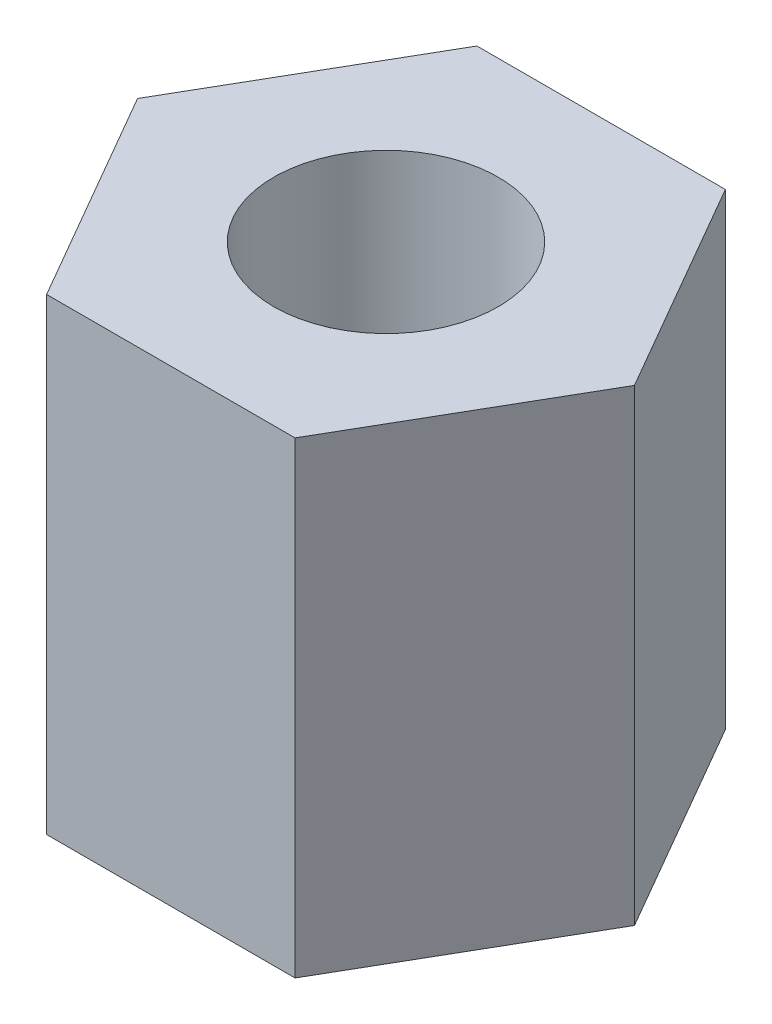
ISO-10303-21;
HEADER;
FILE_DESCRIPTION(('STEP AP214'),'2;1');
FILE_NAME('part.step','',(''),(''),'','','');
FILE_SCHEMA(('AUTOMOTIVE_DESIGN { 1 0 10303 214 1 1 1 1 }'));
ENDSEC;
DATA;
#1=APPLICATION_CONTEXT('core data for automotive mechanical design processes');
#2=APPLICATION_PROTOCOL_DEFINITION('international standard','automotive_design',2000,#1);
#3=PRODUCT_CONTEXT('',#1,'mechanical');
#4=PRODUCT('Part','Part','',(#3));
#5=PRODUCT_RELATED_PRODUCT_CATEGORY('part','',(#4));
#6=PRODUCT_DEFINITION_FORMATION('','',#4);
#7=PRODUCT_DEFINITION_CONTEXT('part definition',#1,'design');
#8=PRODUCT_DEFINITION('design','',#6,#7);
#9=PRODUCT_DEFINITION_SHAPE('','',#8);
#10=(LENGTH_UNIT() NAMED_UNIT(*) SI_UNIT(.MILLI.,.METRE.));
#11=(NAMED_UNIT(*) PLANE_ANGLE_UNIT() SI_UNIT($,.RADIAN.));
#12=(NAMED_UNIT(*) SI_UNIT($,.STERADIAN.) SOLID_ANGLE_UNIT());
#13=UNCERTAINTY_MEASURE_WITH_UNIT(LENGTH_MEASURE(1.E-05),#10,'distance_accuracy_value','');
#14=(GEOMETRIC_REPRESENTATION_CONTEXT(3) GLOBAL_UNCERTAINTY_ASSIGNED_CONTEXT((#13)) GLOBAL_UNIT_ASSIGNED_CONTEXT((#10,
#11,#12)) REPRESENTATION_CONTEXT('',''));
#15=CARTESIAN_POINT('',(0.,0.,0.));
#16=DIRECTION('',(0.,0.,1.));
#17=DIRECTION('',(1.,0.,0.));
#18=AXIS2_PLACEMENT_3D('',#15,#16,#17);
#19=CARTESIAN_POINT('',(0.,5.,0.));
#20=DIRECTION('',(0.,1.,0.));
#21=DIRECTION('',(0.,0.,1.));
#22=AXIS2_PLACEMENT_3D('',#19,#20,#21);
#23=PLANE('',#22);
#24=DIRECTION('',(0.5,0.,-0.866025403784439));
#25=VECTOR('',#24,1.);
#26=CARTESIAN_POINT('',(1.32790561913614,5.,2.3));
#27=LINE('',#26,#25);
#28=CARTESIAN_POINT('',(1.32790561913614,5.,2.3));
#29=VERTEX_POINT('',#28);
#30=CARTESIAN_POINT('',(2.65581123827228,5.,0.));
#31=VERTEX_POINT('',#30);
#32=EDGE_CURVE('E135',#29,#31,#27,.T.);
#33=ORIENTED_EDGE('',*,*,#32,.T.);
#34=DIRECTION('',(-0.5,0.,-0.866025403784438));
#35=VECTOR('',#34,1.);
#36=CARTESIAN_POINT('',(2.65581123827228,5.,0.));
#37=LINE('',#36,#35);
#38=CARTESIAN_POINT('',(1.32790561913614,5.,-2.3));
#39=VERTEX_POINT('',#38);
#40=EDGE_CURVE('E93',#31,#39,#37,.T.);
#41=ORIENTED_EDGE('',*,*,#40,.T.);
#42=DIRECTION('',(-1.,0.,0.));
#43=VECTOR('',#42,1.);
#44=CARTESIAN_POINT('',(1.32790561913614,5.,-2.3));
#45=LINE('',#44,#43);
#46=CARTESIAN_POINT('',(-1.32790561913614,5.,-2.3));
#47=VERTEX_POINT('',#46);
#48=EDGE_CURVE('E106',#39,#47,#45,.T.);
#49=ORIENTED_EDGE('',*,*,#48,.T.);
#50=DIRECTION('',(-0.5,0.,0.866025403784438));
#51=VECTOR('',#50,1.);
#52=CARTESIAN_POINT('',(-1.32790561913614,5.,-2.3));
#53=LINE('',#52,#51);
#54=CARTESIAN_POINT('',(-2.65581123827228,5.,0.));
#55=VERTEX_POINT('',#54);
#56=EDGE_CURVE('E100',#47,#55,#53,.T.);
#57=ORIENTED_EDGE('',*,*,#56,.T.);
#58=DIRECTION('',(0.5,0.,0.866025403784438));
#59=VECTOR('',#58,1.);
#60=CARTESIAN_POINT('',(-2.65581123827228,5.,0.));
#61=LINE('',#60,#59);
#62=CARTESIAN_POINT('',(-1.32790561913614,5.,2.3));
#63=VERTEX_POINT('',#62);
#64=EDGE_CURVE('E104',#55,#63,#61,.T.);
#65=ORIENTED_EDGE('',*,*,#64,.T.);
#66=DIRECTION('',(1.,0.,0.));
#67=VECTOR('',#66,1.);
#68=CARTESIAN_POINT('',(-1.32790561913614,5.,2.3));
#69=LINE('',#68,#67);
#70=EDGE_CURVE('E56',#63,#29,#69,.T.);
#71=ORIENTED_EDGE('',*,*,#70,.T.);
#72=EDGE_LOOP('',(#33,#41,#49,#57,#65,#71));
#73=FACE_BOUND('',#72,.T.);
#74=CARTESIAN_POINT('',(0.,5.,0.));
#75=DIRECTION('',(0.,1.,0.));
#76=DIRECTION('',(0.,0.,1.));
#77=AXIS2_PLACEMENT_3D('',#74,#75,#76);
#78=CIRCLE('',#77,1.2);
#79=CARTESIAN_POINT('',(0.,5.,1.2));
#80=VERTEX_POINT('',#79);
#81=EDGE_CURVE('E128',#80,#80,#78,.T.);
#82=ORIENTED_EDGE('',*,*,#81,.F.);
#83=EDGE_LOOP('',(#82));
#84=FACE_BOUND('',#83,.T.);
#85=ADVANCED_FACE('F39',(#73,#84),#23,.T.);
#86=CARTESIAN_POINT('',(0.,0.,0.));
#87=DIRECTION('',(0.,1.,0.));
#88=DIRECTION('',(0.,0.,1.));
#89=AXIS2_PLACEMENT_3D('',#86,#87,#88);
#90=PLANE('',#89);
#91=DIRECTION('',(0.5,0.,-0.866025403784439));
#92=VECTOR('',#91,1.);
#93=CARTESIAN_POINT('',(1.32790561913614,0.,2.3));
#94=LINE('',#93,#92);
#95=CARTESIAN_POINT('',(1.32790561913614,0.,2.3));
#96=VERTEX_POINT('',#95);
#97=CARTESIAN_POINT('',(2.65581123827228,0.,0.));
#98=VERTEX_POINT('',#97);
#99=EDGE_CURVE('E124',#96,#98,#94,.T.);
#100=ORIENTED_EDGE('',*,*,#99,.F.);
#101=DIRECTION('',(1.,0.,0.));
#102=VECTOR('',#101,1.);
#103=CARTESIAN_POINT('',(-1.32790561913614,0.,2.3));
#104=LINE('',#103,#102);
#105=CARTESIAN_POINT('',(-1.32790561913614,0.,2.3));
#106=VERTEX_POINT('',#105);
#107=EDGE_CURVE('E85',#106,#96,#104,.T.);
#108=ORIENTED_EDGE('',*,*,#107,.F.);
#109=DIRECTION('',(0.5,0.,0.866025403784438));
#110=VECTOR('',#109,1.);
#111=CARTESIAN_POINT('',(-2.65581123827228,0.,0.));
#112=LINE('',#111,#110);
#113=CARTESIAN_POINT('',(-2.65581123827228,0.,0.));
#114=VERTEX_POINT('',#113);
#115=EDGE_CURVE('E79',#114,#106,#112,.T.);
#116=ORIENTED_EDGE('',*,*,#115,.F.);
#117=DIRECTION('',(-0.5,0.,0.866025403784438));
#118=VECTOR('',#117,1.);
#119=CARTESIAN_POINT('',(-1.32790561913614,0.,-2.3));
#120=LINE('',#119,#118);
#121=CARTESIAN_POINT('',(-1.32790561913614,0.,-2.3));
#122=VERTEX_POINT('',#121);
#123=EDGE_CURVE('E114',#122,#114,#120,.T.);
#124=ORIENTED_EDGE('',*,*,#123,.F.);
#125=DIRECTION('',(-1.,0.,0.));
#126=VECTOR('',#125,1.);
#127=CARTESIAN_POINT('',(1.32790561913614,0.,-2.3));
#128=LINE('',#127,#126);
#129=CARTESIAN_POINT('',(1.32790561913614,0.,-2.3));
#130=VERTEX_POINT('',#129);
#131=EDGE_CURVE('E130',#130,#122,#128,.T.);
#132=ORIENTED_EDGE('',*,*,#131,.F.);
#133=DIRECTION('',(-0.5,0.,-0.866025403784438));
#134=VECTOR('',#133,1.);
#135=CARTESIAN_POINT('',(2.65581123827228,0.,0.));
#136=LINE('',#135,#134);
#137=EDGE_CURVE('E127',#98,#130,#136,.T.);
#138=ORIENTED_EDGE('',*,*,#137,.F.);
#139=EDGE_LOOP('',(#100,#108,#116,#124,#132,#138));
#140=FACE_BOUND('',#139,.T.);
#141=CARTESIAN_POINT('',(0.,0.,0.));
#142=DIRECTION('',(0.,1.,0.));
#143=DIRECTION('',(0.,0.,1.));
#144=AXIS2_PLACEMENT_3D('',#141,#142,#143);
#145=CIRCLE('',#144,1.2);
#146=CARTESIAN_POINT('',(0.,0.,1.2));
#147=VERTEX_POINT('',#146);
#148=EDGE_CURVE('E228',#147,#147,#145,.T.);
#149=ORIENTED_EDGE('',*,*,#148,.T.);
#150=EDGE_LOOP('',(#149));
#151=FACE_BOUND('',#150,.T.);
#152=ADVANCED_FACE('F144',(#140,#151),#90,.F.);
#153=CARTESIAN_POINT('',(1.32790561913614,5.,2.3));
#154=DIRECTION('',(-0.866025403784439,0.,-0.5));
#155=DIRECTION('',(-0.5,0.,0.866025403784439));
#156=AXIS2_PLACEMENT_3D('',#153,#154,#155);
#157=PLANE('',#156);
#158=ORIENTED_EDGE('',*,*,#99,.T.);
#159=DIRECTION('',(0.,-1.,0.));
#160=VECTOR('',#159,1.);
#161=CARTESIAN_POINT('',(2.65581123827228,5.,0.));
#162=LINE('',#161,#160);
#163=EDGE_CURVE('E11',#31,#98,#162,.T.);
#164=ORIENTED_EDGE('',*,*,#163,.F.);
#165=ORIENTED_EDGE('',*,*,#32,.F.);
#166=DIRECTION('',(0.,-1.,0.));
#167=VECTOR('',#166,1.);
#168=CARTESIAN_POINT('',(1.32790561913614,5.,2.3));
#169=LINE('',#168,#167);
#170=EDGE_CURVE('E120',#29,#96,#169,.T.);
#171=ORIENTED_EDGE('',*,*,#170,.T.);
#172=EDGE_LOOP('',(#158,#164,#165,#171));
#173=FACE_BOUND('',#172,.T.);
#174=ADVANCED_FACE('F41',(#173),#157,.F.);
#175=CARTESIAN_POINT('',(2.65581123827228,5.,0.));
#176=DIRECTION('',(-0.866025403784438,0.,0.5));
#177=DIRECTION('',(0.5,0.,0.866025403784438));
#178=AXIS2_PLACEMENT_3D('',#175,#176,#177);
#179=PLANE('',#178);
#180=ORIENTED_EDGE('',*,*,#137,.T.);
#181=DIRECTION('',(0.,-1.,0.));
#182=VECTOR('',#181,1.);
#183=CARTESIAN_POINT('',(1.32790561913614,5.,-2.3));
#184=LINE('',#183,#182);
#185=EDGE_CURVE('E48',#39,#130,#184,.T.);
#186=ORIENTED_EDGE('',*,*,#185,.F.);
#187=ORIENTED_EDGE('',*,*,#40,.F.);
#188=ORIENTED_EDGE('',*,*,#163,.T.);
#189=EDGE_LOOP('',(#180,#186,#187,#188));
#190=FACE_BOUND('',#189,.T.);
#191=ADVANCED_FACE('F169',(#190),#179,.F.);
#192=CARTESIAN_POINT('',(1.32790561913614,5.,-2.3));
#193=DIRECTION('',(0.,0.,1.));
#194=DIRECTION('',(1.,0.,0.));
#195=AXIS2_PLACEMENT_3D('',#192,#193,#194);
#196=PLANE('',#195);
#197=ORIENTED_EDGE('',*,*,#131,.T.);
#198=DIRECTION('',(0.,-1.,0.));
#199=VECTOR('',#198,1.);
#200=CARTESIAN_POINT('',(-1.32790561913614,5.,-2.3));
#201=LINE('',#200,#199);
#202=EDGE_CURVE('E115',#47,#122,#201,.T.);
#203=ORIENTED_EDGE('',*,*,#202,.F.);
#204=ORIENTED_EDGE('',*,*,#48,.F.);
#205=ORIENTED_EDGE('',*,*,#185,.T.);
#206=EDGE_LOOP('',(#197,#203,#204,#205));
#207=FACE_BOUND('',#206,.T.);
#208=ADVANCED_FACE('F141',(#207),#196,.F.);
#209=CARTESIAN_POINT('',(-1.32790561913614,5.,-2.3));
#210=DIRECTION('',(0.866025403784439,0.,0.5));
#211=DIRECTION('',(0.5,0.,-0.866025403784439));
#212=AXIS2_PLACEMENT_3D('',#209,#210,#211);
#213=PLANE('',#212);
#214=ORIENTED_EDGE('',*,*,#123,.T.);
#215=DIRECTION('',(0.,-1.,0.));
#216=VECTOR('',#215,1.);
#217=CARTESIAN_POINT('',(-2.65581123827228,5.,0.));
#218=LINE('',#217,#216);
#219=EDGE_CURVE('E111',#55,#114,#218,.T.);
#220=ORIENTED_EDGE('',*,*,#219,.F.);
#221=ORIENTED_EDGE('',*,*,#56,.F.);
#222=ORIENTED_EDGE('',*,*,#202,.T.);
#223=EDGE_LOOP('',(#214,#220,#221,#222));
#224=FACE_BOUND('',#223,.T.);
#225=ADVANCED_FACE('F112',(#224),#213,.F.);
#226=CARTESIAN_POINT('',(-2.65581123827228,5.,0.));
#227=DIRECTION('',(0.866025403784438,0.,-0.5));
#228=DIRECTION('',(-0.5,0.,-0.866025403784438));
#229=AXIS2_PLACEMENT_3D('',#226,#227,#228);
#230=PLANE('',#229);
#231=ORIENTED_EDGE('',*,*,#115,.T.);
#232=DIRECTION('',(0.,-1.,0.));
#233=VECTOR('',#232,1.);
#234=CARTESIAN_POINT('',(-1.32790561913614,5.,2.3));
#235=LINE('',#234,#233);
#236=EDGE_CURVE('E116',#63,#106,#235,.T.);
#237=ORIENTED_EDGE('',*,*,#236,.F.);
#238=ORIENTED_EDGE('',*,*,#64,.F.);
#239=ORIENTED_EDGE('',*,*,#219,.T.);
#240=EDGE_LOOP('',(#231,#237,#238,#239));
#241=FACE_BOUND('',#240,.T.);
#242=ADVANCED_FACE('F118',(#241),#230,.F.);
#243=CARTESIAN_POINT('',(-1.32790561913614,5.,2.3));
#244=DIRECTION('',(0.,0.,-1.));
#245=DIRECTION('',(-1.,0.,0.));
#246=AXIS2_PLACEMENT_3D('',#243,#244,#245);
#247=PLANE('',#246);
#248=ORIENTED_EDGE('',*,*,#107,.T.);
#249=ORIENTED_EDGE('',*,*,#170,.F.);
#250=ORIENTED_EDGE('',*,*,#70,.F.);
#251=ORIENTED_EDGE('',*,*,#236,.T.);
#252=EDGE_LOOP('',(#248,#249,#250,#251));
#253=FACE_BOUND('',#252,.T.);
#254=ADVANCED_FACE('F149',(#253),#247,.F.);
#255=CARTESIAN_POINT('',(0.,5.,0.));
#256=DIRECTION('',(0.,-1.,0.));
#257=DIRECTION('',(0.,0.,-1.));
#258=AXIS2_PLACEMENT_3D('',#255,#256,#257);
#259=CYLINDRICAL_SURFACE('',#258,1.2);
#260=ORIENTED_EDGE('',*,*,#81,.T.);
#261=EDGE_LOOP('',(#260));
#262=FACE_BOUND('',#261,.T.);
#263=ORIENTED_EDGE('',*,*,#148,.F.);
#264=EDGE_LOOP('',(#263));
#265=FACE_BOUND('',#264,.T.);
#266=ADVANCED_FACE('F151',(#262,#265),#259,.F.);
#267=CLOSED_SHELL('',(#85,#152,#174,#191,#208,#225,#242,#254,#266));
#268=MANIFOLD_SOLID_BREP('B2',#267);
#269=ADVANCED_BREP_SHAPE_REPRESENTATION('',(#18,#268),#14);
#270=SHAPE_DEFINITION_REPRESENTATION(#9,#269);
ENDSEC;
END-ISO-10303-21;
